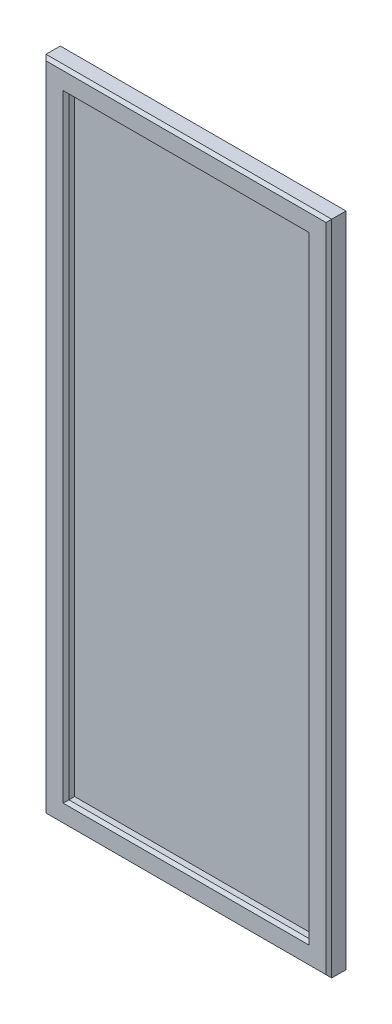
ISO-10303-21;
HEADER;
FILE_DESCRIPTION(('STEP AP214'),'2;1');
FILE_NAME('part.step','',(''),(''),'','','');
FILE_SCHEMA(('AUTOMOTIVE_DESIGN { 1 0 10303 214 1 1 1 1 }'));
ENDSEC;
DATA;
#1=APPLICATION_CONTEXT('core data for automotive mechanical design processes');
#2=APPLICATION_PROTOCOL_DEFINITION('international standard','automotive_design',2000,#1);
#3=PRODUCT_CONTEXT('',#1,'mechanical');
#4=PRODUCT('Part','Part','',(#3));
#5=PRODUCT_RELATED_PRODUCT_CATEGORY('part','',(#4));
#6=PRODUCT_DEFINITION_FORMATION('','',#4);
#7=PRODUCT_DEFINITION_CONTEXT('part definition',#1,'design');
#8=PRODUCT_DEFINITION('design','',#6,#7);
#9=PRODUCT_DEFINITION_SHAPE('','',#8);
#10=(LENGTH_UNIT() NAMED_UNIT(*) SI_UNIT(.MILLI.,.METRE.));
#11=(NAMED_UNIT(*) PLANE_ANGLE_UNIT() SI_UNIT($,.RADIAN.));
#12=(NAMED_UNIT(*) SI_UNIT($,.STERADIAN.) SOLID_ANGLE_UNIT());
#13=UNCERTAINTY_MEASURE_WITH_UNIT(LENGTH_MEASURE(1.E-05),#10,'distance_accuracy_value','');
#14=(GEOMETRIC_REPRESENTATION_CONTEXT(3) GLOBAL_UNCERTAINTY_ASSIGNED_CONTEXT((#13)) GLOBAL_UNIT_ASSIGNED_CONTEXT((#10,
#11,#12)) REPRESENTATION_CONTEXT('',''));
#15=CARTESIAN_POINT('',(0.,0.,0.));
#16=DIRECTION('',(0.,0.,1.));
#17=DIRECTION('',(1.,0.,0.));
#18=AXIS2_PLACEMENT_3D('',#15,#16,#17);
#19=CARTESIAN_POINT('',(957.038675700768,2266.36555250756,30.));
#20=DIRECTION('',(1.,0.,0.));
#21=DIRECTION('',(0.,1.,0.));
#22=AXIS2_PLACEMENT_3D('',#19,#20,#21);
#23=PLANE('',#22);
#24=DIRECTION('',(0.,-1.,0.));
#25=VECTOR('',#24,1.);
#26=CARTESIAN_POINT('',(957.038675700768,2266.36555250756,20.));
#27=LINE('',#26,#25);
#28=CARTESIAN_POINT('',(957.038675700768,2266.36555250756,20.));
#29=VERTEX_POINT('',#28);
#30=CARTESIAN_POINT('',(957.038675700768,48.4287182260568,20.));
#31=VERTEX_POINT('',#30);
#32=EDGE_CURVE('E119',#29,#31,#27,.T.);
#33=ORIENTED_EDGE('',*,*,#32,.F.);
#34=DIRECTION('',(0.,0.,-1.));
#35=VECTOR('',#34,1.);
#36=CARTESIAN_POINT('',(957.038675700768,2266.36555250756,30.));
#37=LINE('',#36,#35);
#38=CARTESIAN_POINT('',(957.038675700768,2266.36555250756,30.));
#39=VERTEX_POINT('',#38);
#40=EDGE_CURVE('E12',#39,#29,#37,.T.);
#41=ORIENTED_EDGE('',*,*,#40,.F.);
#42=DIRECTION('',(0.,-1.,0.));
#43=VECTOR('',#42,1.);
#44=CARTESIAN_POINT('',(957.038675700768,2266.36555250756,30.));
#45=LINE('',#44,#43);
#46=CARTESIAN_POINT('',(957.038675700768,48.4287182260568,30.));
#47=VERTEX_POINT('',#46);
#48=EDGE_CURVE('E113',#39,#47,#45,.T.);
#49=ORIENTED_EDGE('',*,*,#48,.T.);
#50=DIRECTION('',(0.,0.,-1.));
#51=VECTOR('',#50,1.);
#52=CARTESIAN_POINT('',(957.038675700768,48.4287182260568,30.));
#53=LINE('',#52,#51);
#54=EDGE_CURVE('E58',#47,#31,#53,.T.);
#55=ORIENTED_EDGE('',*,*,#54,.T.);
#56=EDGE_LOOP('',(#33,#41,#49,#55));
#57=FACE_BOUND('',#56,.T.);
#58=ADVANCED_FACE('F55',(#57),#23,.T.);
#59=CARTESIAN_POINT('',(957.038675700768,2266.36555250756,30.));
#60=DIRECTION('',(0.,1.,0.));
#61=DIRECTION('',(0.,0.,1.));
#62=AXIS2_PLACEMENT_3D('',#59,#60,#61);
#63=PLANE('',#62);
#64=DIRECTION('',(1.,0.,0.));
#65=VECTOR('',#64,1.);
#66=CARTESIAN_POINT('',(957.038675700768,2266.36555250756,20.));
#67=LINE('',#66,#65);
#68=CARTESIAN_POINT('',(56.6650057793351,2266.36555250756,20.));
#69=VERTEX_POINT('',#68);
#70=EDGE_CURVE('E115',#69,#29,#67,.T.);
#71=ORIENTED_EDGE('',*,*,#70,.F.);
#72=DIRECTION('',(0.,0.,-1.));
#73=VECTOR('',#72,1.);
#74=CARTESIAN_POINT('',(56.6650057793351,2266.36555250756,30.));
#75=LINE('',#74,#73);
#76=CARTESIAN_POINT('',(56.6650057793351,2266.36555250756,30.));
#77=VERTEX_POINT('',#76);
#78=EDGE_CURVE('E64',#77,#69,#75,.T.);
#79=ORIENTED_EDGE('',*,*,#78,.F.);
#80=DIRECTION('',(1.,0.,0.));
#81=VECTOR('',#80,1.);
#82=CARTESIAN_POINT('',(957.038675700768,2266.36555250756,30.));
#83=LINE('',#82,#81);
#84=EDGE_CURVE('E110',#77,#39,#83,.T.);
#85=ORIENTED_EDGE('',*,*,#84,.T.);
#86=ORIENTED_EDGE('',*,*,#40,.T.);
#87=EDGE_LOOP('',(#71,#79,#85,#86));
#88=FACE_BOUND('',#87,.T.);
#89=ADVANCED_FACE('F129',(#88),#63,.T.);
#90=CARTESIAN_POINT('',(56.6650057793351,2266.36555250756,30.));
#91=DIRECTION('',(-1.,0.,0.));
#92=DIRECTION('',(0.,-1.,0.));
#93=AXIS2_PLACEMENT_3D('',#90,#91,#92);
#94=PLANE('',#93);
#95=DIRECTION('',(0.,1.,0.));
#96=VECTOR('',#95,1.);
#97=CARTESIAN_POINT('',(56.6650057793351,2266.36555250756,20.));
#98=LINE('',#97,#96);
#99=CARTESIAN_POINT('',(56.665005779335,48.4287182260568,20.));
#100=VERTEX_POINT('',#99);
#101=EDGE_CURVE('E105',#100,#69,#98,.T.);
#102=ORIENTED_EDGE('',*,*,#101,.F.);
#103=DIRECTION('',(0.,0.,-1.));
#104=VECTOR('',#103,1.);
#105=CARTESIAN_POINT('',(56.665005779335,48.4287182260568,30.));
#106=LINE('',#105,#104);
#107=CARTESIAN_POINT('',(56.665005779335,48.4287182260568,30.));
#108=VERTEX_POINT('',#107);
#109=EDGE_CURVE('E100',#108,#100,#106,.T.);
#110=ORIENTED_EDGE('',*,*,#109,.F.);
#111=DIRECTION('',(0.,1.,0.));
#112=VECTOR('',#111,1.);
#113=CARTESIAN_POINT('',(56.6650057793351,2266.36555250756,30.));
#114=LINE('',#113,#112);
#115=EDGE_CURVE('E103',#108,#77,#114,.T.);
#116=ORIENTED_EDGE('',*,*,#115,.T.);
#117=ORIENTED_EDGE('',*,*,#78,.T.);
#118=EDGE_LOOP('',(#102,#110,#116,#117));
#119=FACE_BOUND('',#118,.T.);
#120=ADVANCED_FACE('F102',(#119),#94,.T.);
#121=CARTESIAN_POINT('',(957.038675700768,48.4287182260568,30.));
#122=DIRECTION('',(0.,-1.,0.));
#123=DIRECTION('',(0.,0.,-1.));
#124=AXIS2_PLACEMENT_3D('',#121,#122,#123);
#125=PLANE('',#124);
#126=DIRECTION('',(-1.,0.,0.));
#127=VECTOR('',#126,1.);
#128=CARTESIAN_POINT('',(957.038675700768,48.4287182260568,20.));
#129=LINE('',#128,#127);
#130=EDGE_CURVE('E122',#31,#100,#129,.T.);
#131=ORIENTED_EDGE('',*,*,#130,.F.);
#132=ORIENTED_EDGE('',*,*,#54,.F.);
#133=DIRECTION('',(-1.,0.,0.));
#134=VECTOR('',#133,1.);
#135=CARTESIAN_POINT('',(957.038675700768,48.4287182260568,30.));
#136=LINE('',#135,#134);
#137=EDGE_CURVE('E109',#47,#108,#136,.T.);
#138=ORIENTED_EDGE('',*,*,#137,.T.);
#139=ORIENTED_EDGE('',*,*,#109,.T.);
#140=EDGE_LOOP('',(#131,#132,#138,#139));
#141=FACE_BOUND('',#140,.T.);
#142=ADVANCED_FACE('F112',(#141),#125,.T.);
#143=CARTESIAN_POINT('',(0.,0.,30.));
#144=DIRECTION('',(0.,0.,-1.));
#145=DIRECTION('',(-1.,0.,0.));
#146=AXIS2_PLACEMENT_3D('',#143,#144,#145);
#147=PLANE('',#146);
#148=ORIENTED_EDGE('',*,*,#48,.F.);
#149=ORIENTED_EDGE('',*,*,#84,.F.);
#150=ORIENTED_EDGE('',*,*,#115,.F.);
#151=ORIENTED_EDGE('',*,*,#137,.F.);
#152=EDGE_LOOP('',(#148,#149,#150,#151));
#153=FACE_BOUND('',#152,.T.);
#154=ADVANCED_FACE('F108',(#153),#147,.F.);
#155=CARTESIAN_POINT('',(0.,0.,20.));
#156=DIRECTION('',(0.,0.,-1.));
#157=DIRECTION('',(-1.,0.,0.));
#158=AXIS2_PLACEMENT_3D('',#155,#156,#157);
#159=PLANE('',#158);
#160=ORIENTED_EDGE('',*,*,#32,.T.);
#161=ORIENTED_EDGE('',*,*,#130,.T.);
#162=ORIENTED_EDGE('',*,*,#101,.T.);
#163=ORIENTED_EDGE('',*,*,#70,.T.);
#164=EDGE_LOOP('',(#160,#161,#162,#163));
#165=FACE_BOUND('',#164,.T.);
#166=ADVANCED_FACE('F128',(#165),#159,.T.);
#167=CLOSED_SHELL('',(#58,#89,#120,#142,#154,#166));
#168=MANIFOLD_SOLID_BREP('B2',#167);
#169=CARTESIAN_POINT('',(0.,0.,60.));
#170=DIRECTION('',(0.,0.,-1.));
#171=DIRECTION('',(-1.,0.,0.));
#172=AXIS2_PLACEMENT_3D('',#169,#170,#171);
#173=PLANE('',#172);
#174=DIRECTION('',(1.,0.,0.));
#175=VECTOR('',#174,1.);
#176=CARTESIAN_POINT('',(920.,2230.,60.));
#177=LINE('',#176,#175);
#178=CARTESIAN_POINT('',(70.,2230.,60.));
#179=VERTEX_POINT('',#178);
#180=CARTESIAN_POINT('',(930.,2230.,60.));
#181=VERTEX_POINT('',#180);
#182=EDGE_CURVE('E344',#179,#181,#177,.T.);
#183=ORIENTED_EDGE('',*,*,#182,.T.);
#184=DIRECTION('',(0.,-1.,0.));
#185=VECTOR('',#184,1.);
#186=CARTESIAN_POINT('',(930.,80.,60.));
#187=LINE('',#186,#185);
#188=CARTESIAN_POINT('',(930.,70.,60.));
#189=VERTEX_POINT('',#188);
#190=EDGE_CURVE('E346',#181,#189,#187,.T.);
#191=ORIENTED_EDGE('',*,*,#190,.T.);
#192=DIRECTION('',(-1.,0.,0.));
#193=VECTOR('',#192,1.);
#194=CARTESIAN_POINT('',(80.,70.,60.));
#195=LINE('',#194,#193);
#196=CARTESIAN_POINT('',(70.,70.,60.));
#197=VERTEX_POINT('',#196);
#198=EDGE_CURVE('E340',#189,#197,#195,.T.);
#199=ORIENTED_EDGE('',*,*,#198,.T.);
#200=DIRECTION('',(0.,1.,0.));
#201=VECTOR('',#200,1.);
#202=CARTESIAN_POINT('',(70.,2220.,60.));
#203=LINE('',#202,#201);
#204=EDGE_CURVE('E342',#197,#179,#203,.T.);
#205=ORIENTED_EDGE('',*,*,#204,.T.);
#206=EDGE_LOOP('',(#183,#191,#199,#205));
#207=FACE_BOUND('',#206,.T.);
#208=DIRECTION('',(0.,1.,0.));
#209=VECTOR('',#208,1.);
#210=CARTESIAN_POINT('',(990.,0.,60.));
#211=LINE('',#210,#209);
#212=CARTESIAN_POINT('',(990.,10.,60.));
#213=VERTEX_POINT('',#212);
#214=CARTESIAN_POINT('',(990.,2290.,60.));
#215=VERTEX_POINT('',#214);
#216=EDGE_CURVE('E335',#213,#215,#211,.T.);
#217=ORIENTED_EDGE('',*,*,#216,.T.);
#218=DIRECTION('',(-1.,0.,0.));
#219=VECTOR('',#218,1.);
#220=CARTESIAN_POINT('',(0.,2290.,60.));
#221=LINE('',#220,#219);
#222=CARTESIAN_POINT('',(10.,2290.,60.));
#223=VERTEX_POINT('',#222);
#224=EDGE_CURVE('E337',#215,#223,#221,.T.);
#225=ORIENTED_EDGE('',*,*,#224,.T.);
#226=DIRECTION('',(0.,-1.,0.));
#227=VECTOR('',#226,1.);
#228=CARTESIAN_POINT('',(10.,0.,60.));
#229=LINE('',#228,#227);
#230=CARTESIAN_POINT('',(10.,10.,60.));
#231=VERTEX_POINT('',#230);
#232=EDGE_CURVE('E331',#223,#231,#229,.T.);
#233=ORIENTED_EDGE('',*,*,#232,.T.);
#234=DIRECTION('',(1.,0.,0.));
#235=VECTOR('',#234,1.);
#236=CARTESIAN_POINT('',(0.,10.,60.));
#237=LINE('',#236,#235);
#238=EDGE_CURVE('E333',#231,#213,#237,.T.);
#239=ORIENTED_EDGE('',*,*,#238,.T.);
#240=EDGE_LOOP('',(#217,#225,#233,#239));
#241=FACE_BOUND('',#240,.T.);
#242=ADVANCED_FACE('F179',(#207,#241),#173,.F.);
#243=CARTESIAN_POINT('',(0.,0.,0.));
#244=DIRECTION('',(0.,0.,-1.));
#245=DIRECTION('',(-1.,0.,0.));
#246=AXIS2_PLACEMENT_3D('',#243,#244,#245);
#247=PLANE('',#246);
#248=DIRECTION('',(0.,-1.,0.));
#249=VECTOR('',#248,1.);
#250=CARTESIAN_POINT('',(0.,0.,0.));
#251=LINE('',#250,#249);
#252=CARTESIAN_POINT('',(0.,2300.,0.));
#253=VERTEX_POINT('',#252);
#254=CARTESIAN_POINT('',(0.,0.,0.));
#255=VERTEX_POINT('',#254);
#256=EDGE_CURVE('E282',#253,#255,#251,.T.);
#257=ORIENTED_EDGE('',*,*,#256,.F.);
#258=DIRECTION('',(-1.,0.,0.));
#259=VECTOR('',#258,1.);
#260=CARTESIAN_POINT('',(0.,2300.,0.));
#261=LINE('',#260,#259);
#262=CARTESIAN_POINT('',(1000.,2300.,0.));
#263=VERTEX_POINT('',#262);
#264=EDGE_CURVE('E318',#263,#253,#261,.T.);
#265=ORIENTED_EDGE('',*,*,#264,.F.);
#266=DIRECTION('',(0.,1.,0.));
#267=VECTOR('',#266,1.);
#268=CARTESIAN_POINT('',(1000.,0.,0.));
#269=LINE('',#268,#267);
#270=CARTESIAN_POINT('',(1000.,0.,0.));
#271=VERTEX_POINT('',#270);
#272=EDGE_CURVE('E315',#271,#263,#269,.T.);
#273=ORIENTED_EDGE('',*,*,#272,.F.);
#274=DIRECTION('',(1.,0.,0.));
#275=VECTOR('',#274,1.);
#276=CARTESIAN_POINT('',(0.,0.,0.));
#277=LINE('',#276,#275);
#278=EDGE_CURVE('E312',#255,#271,#277,.T.);
#279=ORIENTED_EDGE('',*,*,#278,.F.);
#280=EDGE_LOOP('',(#257,#265,#273,#279));
#281=FACE_BOUND('',#280,.T.);
#282=DIRECTION('',(0.,-1.,0.));
#283=VECTOR('',#282,1.);
#284=CARTESIAN_POINT('',(80.,80.,0.));
#285=LINE('',#284,#283);
#286=CARTESIAN_POINT('',(80.,2220.,0.));
#287=VERTEX_POINT('',#286);
#288=CARTESIAN_POINT('',(80.,80.,0.));
#289=VERTEX_POINT('',#288);
#290=EDGE_CURVE('E296',#287,#289,#285,.T.);
#291=ORIENTED_EDGE('',*,*,#290,.T.);
#292=DIRECTION('',(1.,0.,0.));
#293=VECTOR('',#292,1.);
#294=CARTESIAN_POINT('',(80.,80.,0.));
#295=LINE('',#294,#293);
#296=CARTESIAN_POINT('',(920.,80.,0.));
#297=VERTEX_POINT('',#296);
#298=EDGE_CURVE('E275',#289,#297,#295,.T.);
#299=ORIENTED_EDGE('',*,*,#298,.T.);
#300=DIRECTION('',(0.,1.,0.));
#301=VECTOR('',#300,1.);
#302=CARTESIAN_POINT('',(920.,80.,0.));
#303=LINE('',#302,#301);
#304=CARTESIAN_POINT('',(920.,2220.,0.));
#305=VERTEX_POINT('',#304);
#306=EDGE_CURVE('E286',#297,#305,#303,.T.);
#307=ORIENTED_EDGE('',*,*,#306,.T.);
#308=DIRECTION('',(-1.,0.,0.));
#309=VECTOR('',#308,1.);
#310=CARTESIAN_POINT('',(80.,2220.,0.));
#311=LINE('',#310,#309);
#312=EDGE_CURVE('E292',#305,#287,#311,.T.);
#313=ORIENTED_EDGE('',*,*,#312,.T.);
#314=EDGE_LOOP('',(#291,#299,#307,#313));
#315=FACE_BOUND('',#314,.T.);
#316=ADVANCED_FACE('F294',(#281,#315),#247,.T.);
#317=CARTESIAN_POINT('',(0.,0.,60.));
#318=DIRECTION('',(1.,0.,0.));
#319=DIRECTION('',(0.,0.,-1.));
#320=AXIS2_PLACEMENT_3D('',#317,#318,#319);
#321=PLANE('',#320);
#322=DIRECTION('',(0.,0.,-1.));
#323=VECTOR('',#322,1.);
#324=CARTESIAN_POINT('',(0.,0.,60.));
#325=LINE('',#324,#323);
#326=CARTESIAN_POINT('',(0.,0.,50.));
#327=VERTEX_POINT('',#326);
#328=EDGE_CURVE('E327',#327,#255,#325,.T.);
#329=ORIENTED_EDGE('',*,*,#328,.F.);
#330=DIRECTION('',(0.,1.,0.));
#331=VECTOR('',#330,1.);
#332=CARTESIAN_POINT('',(0.,0.,50.));
#333=LINE('',#332,#331);
#334=CARTESIAN_POINT('',(0.,2300.,50.));
#335=VERTEX_POINT('',#334);
#336=EDGE_CURVE('E53',#327,#335,#333,.T.);
#337=ORIENTED_EDGE('',*,*,#336,.T.);
#338=DIRECTION('',(0.,0.,-1.));
#339=VECTOR('',#338,1.);
#340=CARTESIAN_POINT('',(0.,2300.,60.));
#341=LINE('',#340,#339);
#342=EDGE_CURVE('E321',#335,#253,#341,.T.);
#343=ORIENTED_EDGE('',*,*,#342,.T.);
#344=ORIENTED_EDGE('',*,*,#256,.T.);
#345=EDGE_LOOP('',(#329,#337,#343,#344));
#346=FACE_BOUND('',#345,.T.);
#347=ADVANCED_FACE('F386',(#346),#321,.F.);
#348=CARTESIAN_POINT('',(0.,0.,60.));
#349=DIRECTION('',(0.,1.,0.));
#350=DIRECTION('',(0.,0.,1.));
#351=AXIS2_PLACEMENT_3D('',#348,#349,#350);
#352=PLANE('',#351);
#353=DIRECTION('',(0.,0.,-1.));
#354=VECTOR('',#353,1.);
#355=CARTESIAN_POINT('',(1000.,0.,60.));
#356=LINE('',#355,#354);
#357=CARTESIAN_POINT('',(1000.,0.,50.));
#358=VERTEX_POINT('',#357);
#359=EDGE_CURVE('E325',#358,#271,#356,.T.);
#360=ORIENTED_EDGE('',*,*,#359,.F.);
#361=DIRECTION('',(-1.,0.,0.));
#362=VECTOR('',#361,1.);
#363=CARTESIAN_POINT('',(0.,0.,50.));
#364=LINE('',#363,#362);
#365=EDGE_CURVE('E189',#358,#327,#364,.T.);
#366=ORIENTED_EDGE('',*,*,#365,.T.);
#367=ORIENTED_EDGE('',*,*,#328,.T.);
#368=ORIENTED_EDGE('',*,*,#278,.T.);
#369=EDGE_LOOP('',(#360,#366,#367,#368));
#370=FACE_BOUND('',#369,.T.);
#371=ADVANCED_FACE('F413',(#370),#352,.F.);
#372=CARTESIAN_POINT('',(1000.,0.,60.));
#373=DIRECTION('',(-1.,0.,0.));
#374=DIRECTION('',(0.,0.,1.));
#375=AXIS2_PLACEMENT_3D('',#372,#373,#374);
#376=PLANE('',#375);
#377=DIRECTION('',(0.,0.,-1.));
#378=VECTOR('',#377,1.);
#379=CARTESIAN_POINT('',(1000.,2300.,60.));
#380=LINE('',#379,#378);
#381=CARTESIAN_POINT('',(1000.,2300.,50.));
#382=VERTEX_POINT('',#381);
#383=EDGE_CURVE('E323',#382,#263,#380,.T.);
#384=ORIENTED_EDGE('',*,*,#383,.F.);
#385=DIRECTION('',(0.,-1.,0.));
#386=VECTOR('',#385,1.);
#387=CARTESIAN_POINT('',(1000.,0.,50.));
#388=LINE('',#387,#386);
#389=EDGE_CURVE('E204',#382,#358,#388,.T.);
#390=ORIENTED_EDGE('',*,*,#389,.T.);
#391=ORIENTED_EDGE('',*,*,#359,.T.);
#392=ORIENTED_EDGE('',*,*,#272,.T.);
#393=EDGE_LOOP('',(#384,#390,#391,#392));
#394=FACE_BOUND('',#393,.T.);
#395=ADVANCED_FACE('F410',(#394),#376,.F.);
#396=CARTESIAN_POINT('',(0.,2300.,60.));
#397=DIRECTION('',(0.,-1.,0.));
#398=DIRECTION('',(0.,0.,-1.));
#399=AXIS2_PLACEMENT_3D('',#396,#397,#398);
#400=PLANE('',#399);
#401=ORIENTED_EDGE('',*,*,#342,.F.);
#402=DIRECTION('',(1.,0.,0.));
#403=VECTOR('',#402,1.);
#404=CARTESIAN_POINT('',(0.,2300.,50.));
#405=LINE('',#404,#403);
#406=EDGE_CURVE('E354',#335,#382,#405,.T.);
#407=ORIENTED_EDGE('',*,*,#406,.T.);
#408=ORIENTED_EDGE('',*,*,#383,.T.);
#409=ORIENTED_EDGE('',*,*,#264,.T.);
#410=EDGE_LOOP('',(#401,#407,#408,#409));
#411=FACE_BOUND('',#410,.T.);
#412=ADVANCED_FACE('F389',(#411),#400,.F.);
#413=CARTESIAN_POINT('',(80.,80.,60.));
#414=DIRECTION('',(0.,1.,0.));
#415=DIRECTION('',(0.,0.,1.));
#416=AXIS2_PLACEMENT_3D('',#413,#414,#415);
#417=PLANE('',#416);
#418=DIRECTION('',(0.,0.,-1.));
#419=VECTOR('',#418,1.);
#420=CARTESIAN_POINT('',(80.,80.,60.));
#421=LINE('',#420,#419);
#422=CARTESIAN_POINT('',(80.,80.,50.));
#423=VERTEX_POINT('',#422);
#424=EDGE_CURVE('E305',#423,#289,#421,.T.);
#425=ORIENTED_EDGE('',*,*,#424,.F.);
#426=DIRECTION('',(1.,0.,0.));
#427=VECTOR('',#426,1.);
#428=CARTESIAN_POINT('',(920.,80.,50.));
#429=LINE('',#428,#427);
#430=CARTESIAN_POINT('',(920.,80.,50.));
#431=VERTEX_POINT('',#430);
#432=EDGE_CURVE('E278',#423,#431,#429,.T.);
#433=ORIENTED_EDGE('',*,*,#432,.T.);
#434=DIRECTION('',(0.,0.,-1.));
#435=VECTOR('',#434,1.);
#436=CARTESIAN_POINT('',(920.,80.,60.));
#437=LINE('',#436,#435);
#438=EDGE_CURVE('E270',#431,#297,#437,.T.);
#439=ORIENTED_EDGE('',*,*,#438,.T.);
#440=ORIENTED_EDGE('',*,*,#298,.F.);
#441=EDGE_LOOP('',(#425,#433,#439,#440));
#442=FACE_BOUND('',#441,.T.);
#443=ADVANCED_FACE('F273',(#442),#417,.T.);
#444=CARTESIAN_POINT('',(920.,80.,60.));
#445=DIRECTION('',(-1.,0.,0.));
#446=DIRECTION('',(0.,0.,1.));
#447=AXIS2_PLACEMENT_3D('',#444,#445,#446);
#448=PLANE('',#447);
#449=ORIENTED_EDGE('',*,*,#438,.F.);
#450=DIRECTION('',(0.,1.,0.));
#451=VECTOR('',#450,1.);
#452=CARTESIAN_POINT('',(920.,2220.,50.));
#453=LINE('',#452,#451);
#454=CARTESIAN_POINT('',(920.,2220.,50.));
#455=VERTEX_POINT('',#454);
#456=EDGE_CURVE('E329',#431,#455,#453,.T.);
#457=ORIENTED_EDGE('',*,*,#456,.T.);
#458=DIRECTION('',(0.,0.,-1.));
#459=VECTOR('',#458,1.);
#460=CARTESIAN_POINT('',(920.,2220.,60.));
#461=LINE('',#460,#459);
#462=EDGE_CURVE('E283',#455,#305,#461,.T.);
#463=ORIENTED_EDGE('',*,*,#462,.T.);
#464=ORIENTED_EDGE('',*,*,#306,.F.);
#465=EDGE_LOOP('',(#449,#457,#463,#464));
#466=FACE_BOUND('',#465,.T.);
#467=ADVANCED_FACE('F287',(#466),#448,.T.);
#468=CARTESIAN_POINT('',(80.,2220.,60.));
#469=DIRECTION('',(0.,-1.,0.));
#470=DIRECTION('',(0.,0.,-1.));
#471=AXIS2_PLACEMENT_3D('',#468,#469,#470);
#472=PLANE('',#471);
#473=ORIENTED_EDGE('',*,*,#462,.F.);
#474=DIRECTION('',(-1.,0.,0.));
#475=VECTOR('',#474,1.);
#476=CARTESIAN_POINT('',(80.,2220.,50.));
#477=LINE('',#476,#475);
#478=CARTESIAN_POINT('',(80.,2220.,50.));
#479=VERTEX_POINT('',#478);
#480=EDGE_CURVE('E349',#455,#479,#477,.T.);
#481=ORIENTED_EDGE('',*,*,#480,.T.);
#482=DIRECTION('',(0.,0.,-1.));
#483=VECTOR('',#482,1.);
#484=CARTESIAN_POINT('',(80.,2220.,60.));
#485=LINE('',#484,#483);
#486=EDGE_CURVE('E307',#479,#287,#485,.T.);
#487=ORIENTED_EDGE('',*,*,#486,.T.);
#488=ORIENTED_EDGE('',*,*,#312,.F.);
#489=EDGE_LOOP('',(#473,#481,#487,#488));
#490=FACE_BOUND('',#489,.T.);
#491=ADVANCED_FACE('F491',(#490),#472,.T.);
#492=CARTESIAN_POINT('',(80.,80.,60.));
#493=DIRECTION('',(1.,0.,0.));
#494=DIRECTION('',(0.,0.,-1.));
#495=AXIS2_PLACEMENT_3D('',#492,#493,#494);
#496=PLANE('',#495);
#497=ORIENTED_EDGE('',*,*,#486,.F.);
#498=DIRECTION('',(0.,-1.,0.));
#499=VECTOR('',#498,1.);
#500=CARTESIAN_POINT('',(80.,80.,50.));
#501=LINE('',#500,#499);
#502=EDGE_CURVE('E351',#479,#423,#501,.T.);
#503=ORIENTED_EDGE('',*,*,#502,.T.);
#504=ORIENTED_EDGE('',*,*,#424,.T.);
#505=ORIENTED_EDGE('',*,*,#290,.F.);
#506=EDGE_LOOP('',(#497,#503,#504,#505));
#507=FACE_BOUND('',#506,.T.);
#508=ADVANCED_FACE('F444',(#507),#496,.T.);
#509=CARTESIAN_POINT('',(80.,80.,50.));
#510=DIRECTION('',(0.707106781186547,0.,0.707106781186547));
#511=DIRECTION('',(0.,1.,0.));
#512=AXIS2_PLACEMENT_3D('',#509,#510,#511);
#513=PLANE('',#512);
#514=DIRECTION('',(-0.57735026918963,0.577350269189617,0.57735026918963));
#515=VECTOR('',#514,1.);
#516=CARTESIAN_POINT('',(80.,2220.,50.));
#517=LINE('',#516,#515);
#518=EDGE_CURVE('E300',#179,#479,#517,.F.);
#519=ORIENTED_EDGE('',*,*,#518,.F.);
#520=ORIENTED_EDGE('',*,*,#204,.F.);
#521=DIRECTION('',(-0.577350269189626,-0.577350269189626,0.577350269189626));
#522=VECTOR('',#521,1.);
#523=CARTESIAN_POINT('',(80.,80.,50.));
#524=LINE('',#523,#522);
#525=EDGE_CURVE('E297',#423,#197,#524,.T.);
#526=ORIENTED_EDGE('',*,*,#525,.F.);
#527=ORIENTED_EDGE('',*,*,#502,.F.);
#528=EDGE_LOOP('',(#519,#520,#526,#527));
#529=FACE_BOUND('',#528,.T.);
#530=ADVANCED_FACE('F438',(#529),#513,.T.);
#531=CARTESIAN_POINT('',(80.,80.,50.));
#532=DIRECTION('',(0.,0.707106781186547,0.707106781186547));
#533=DIRECTION('',(-1.,0.,0.));
#534=AXIS2_PLACEMENT_3D('',#531,#532,#533);
#535=PLANE('',#534);
#536=ORIENTED_EDGE('',*,*,#525,.T.);
#537=ORIENTED_EDGE('',*,*,#198,.F.);
#538=DIRECTION('',(-0.577350269189626,0.577350269189626,-0.577350269189626));
#539=VECTOR('',#538,1.);
#540=CARTESIAN_POINT('',(920.,80.,50.));
#541=LINE('',#540,#539);
#542=EDGE_CURVE('E361',#431,#189,#541,.F.);
#543=ORIENTED_EDGE('',*,*,#542,.F.);
#544=ORIENTED_EDGE('',*,*,#432,.F.);
#545=EDGE_LOOP('',(#536,#537,#543,#544));
#546=FACE_BOUND('',#545,.T.);
#547=ADVANCED_FACE('F431',(#546),#535,.T.);
#548=CARTESIAN_POINT('',(80.,2220.,50.));
#549=DIRECTION('',(0.,-0.707106781186555,0.70710678118654));
#550=DIRECTION('',(1.,0.,0.));
#551=AXIS2_PLACEMENT_3D('',#548,#549,#550);
#552=PLANE('',#551);
#553=ORIENTED_EDGE('',*,*,#518,.T.);
#554=ORIENTED_EDGE('',*,*,#480,.F.);
#555=DIRECTION('',(0.57735026918963,0.577350269189617,0.57735026918963));
#556=VECTOR('',#555,1.);
#557=CARTESIAN_POINT('',(206.666666666672,1506.66666666669,-663.333333333328));
#558=LINE('',#557,#556);
#559=EDGE_CURVE('E359',#181,#455,#558,.F.);
#560=ORIENTED_EDGE('',*,*,#559,.F.);
#561=ORIENTED_EDGE('',*,*,#182,.F.);
#562=EDGE_LOOP('',(#553,#554,#560,#561));
#563=FACE_BOUND('',#562,.T.);
#564=ADVANCED_FACE('F424',(#563),#552,.T.);
#565=CARTESIAN_POINT('',(920.,80.,50.));
#566=DIRECTION('',(-0.707106781186547,0.,0.707106781186547));
#567=DIRECTION('',(0.,-1.,0.));
#568=AXIS2_PLACEMENT_3D('',#565,#566,#567);
#569=PLANE('',#568);
#570=ORIENTED_EDGE('',*,*,#542,.T.);
#571=ORIENTED_EDGE('',*,*,#190,.F.);
#572=ORIENTED_EDGE('',*,*,#559,.T.);
#573=ORIENTED_EDGE('',*,*,#456,.F.);
#574=EDGE_LOOP('',(#570,#571,#572,#573));
#575=FACE_BOUND('',#574,.T.);
#576=ADVANCED_FACE('F418',(#575),#569,.T.);
#577=CARTESIAN_POINT('',(0.,10.,60.));
#578=DIRECTION('',(0.,0.707106781186548,-0.707106781186547));
#579=DIRECTION('',(1.,0.,0.));
#580=AXIS2_PLACEMENT_3D('',#577,#578,#579);
#581=PLANE('',#580);
#582=DIRECTION('',(0.577350269189626,0.577350269189626,0.577350269189626));
#583=VECTOR('',#582,1.);
#584=CARTESIAN_POINT('',(6.66666666666667,6.66666666666667,56.6666666666667));
#585=LINE('',#584,#583);
#586=EDGE_CURVE('E368',#327,#231,#585,.T.);
#587=ORIENTED_EDGE('',*,*,#586,.F.);
#588=ORIENTED_EDGE('',*,*,#365,.F.);
#589=DIRECTION('',(-0.577350269189626,0.577350269189626,0.577350269189626));
#590=VECTOR('',#589,1.);
#591=CARTESIAN_POINT('',(660.,340.,390.));
#592=LINE('',#591,#590);
#593=EDGE_CURVE('E184',#213,#358,#592,.F.);
#594=ORIENTED_EDGE('',*,*,#593,.F.);
#595=ORIENTED_EDGE('',*,*,#238,.F.);
#596=EDGE_LOOP('',(#587,#588,#594,#595));
#597=FACE_BOUND('',#596,.T.);
#598=ADVANCED_FACE('F182',(#597),#581,.F.);
#599=CARTESIAN_POINT('',(990.,0.,60.));
#600=DIRECTION('',(-0.707106781186547,0.,-0.707106781186547));
#601=DIRECTION('',(0.,1.,0.));
#602=AXIS2_PLACEMENT_3D('',#599,#600,#601);
#603=PLANE('',#602);
#604=ORIENTED_EDGE('',*,*,#593,.T.);
#605=ORIENTED_EDGE('',*,*,#389,.F.);
#606=DIRECTION('',(-0.57735026918963,-0.577350269189617,0.57735026918963));
#607=VECTOR('',#606,1.);
#608=CARTESIAN_POINT('',(226.666666666672,1526.66666666669,823.333333333328));
#609=LINE('',#608,#607);
#610=EDGE_CURVE('E367',#215,#382,#609,.F.);
#611=ORIENTED_EDGE('',*,*,#610,.F.);
#612=ORIENTED_EDGE('',*,*,#216,.F.);
#613=EDGE_LOOP('',(#604,#605,#611,#612));
#614=FACE_BOUND('',#613,.T.);
#615=ADVANCED_FACE('F378',(#614),#603,.F.);
#616=CARTESIAN_POINT('',(10.,0.,60.));
#617=DIRECTION('',(0.707106781186548,0.,-0.707106781186547));
#618=DIRECTION('',(0.,-1.,0.));
#619=AXIS2_PLACEMENT_3D('',#616,#617,#618);
#620=PLANE('',#619);
#621=ORIENTED_EDGE('',*,*,#586,.T.);
#622=ORIENTED_EDGE('',*,*,#232,.F.);
#623=DIRECTION('',(-0.57735026918963,0.577350269189617,-0.57735026918963));
#624=VECTOR('',#623,1.);
#625=CARTESIAN_POINT('',(773.333333333327,1526.66666666669,823.333333333328));
#626=LINE('',#625,#624);
#627=EDGE_CURVE('E365',#335,#223,#626,.F.);
#628=ORIENTED_EDGE('',*,*,#627,.F.);
#629=ORIENTED_EDGE('',*,*,#336,.F.);
#630=EDGE_LOOP('',(#621,#622,#628,#629));
#631=FACE_BOUND('',#630,.T.);
#632=ADVANCED_FACE('F383',(#631),#620,.F.);
#633=CARTESIAN_POINT('',(0.,2290.,60.));
#634=DIRECTION('',(0.,-0.707106781186555,-0.70710678118654));
#635=DIRECTION('',(-1.,0.,0.));
#636=AXIS2_PLACEMENT_3D('',#633,#634,#635);
#637=PLANE('',#636);
#638=ORIENTED_EDGE('',*,*,#610,.T.);
#639=ORIENTED_EDGE('',*,*,#406,.F.);
#640=ORIENTED_EDGE('',*,*,#627,.T.);
#641=ORIENTED_EDGE('',*,*,#224,.F.);
#642=EDGE_LOOP('',(#638,#639,#640,#641));
#643=FACE_BOUND('',#642,.T.);
#644=ADVANCED_FACE('F393',(#643),#637,.F.);
#645=CLOSED_SHELL('',(#242,#316,#347,#371,#395,#412,#443,#467,#491,#508,#530,#547,#564,#576,
#598,#615,#632,#644));
#646=MANIFOLD_SOLID_BREP('B6',#645);
#647=ADVANCED_BREP_SHAPE_REPRESENTATION('',(#18,#168,#646),#14);
#648=SHAPE_DEFINITION_REPRESENTATION(#9,#647);
ENDSEC;
END-ISO-10303-21;
